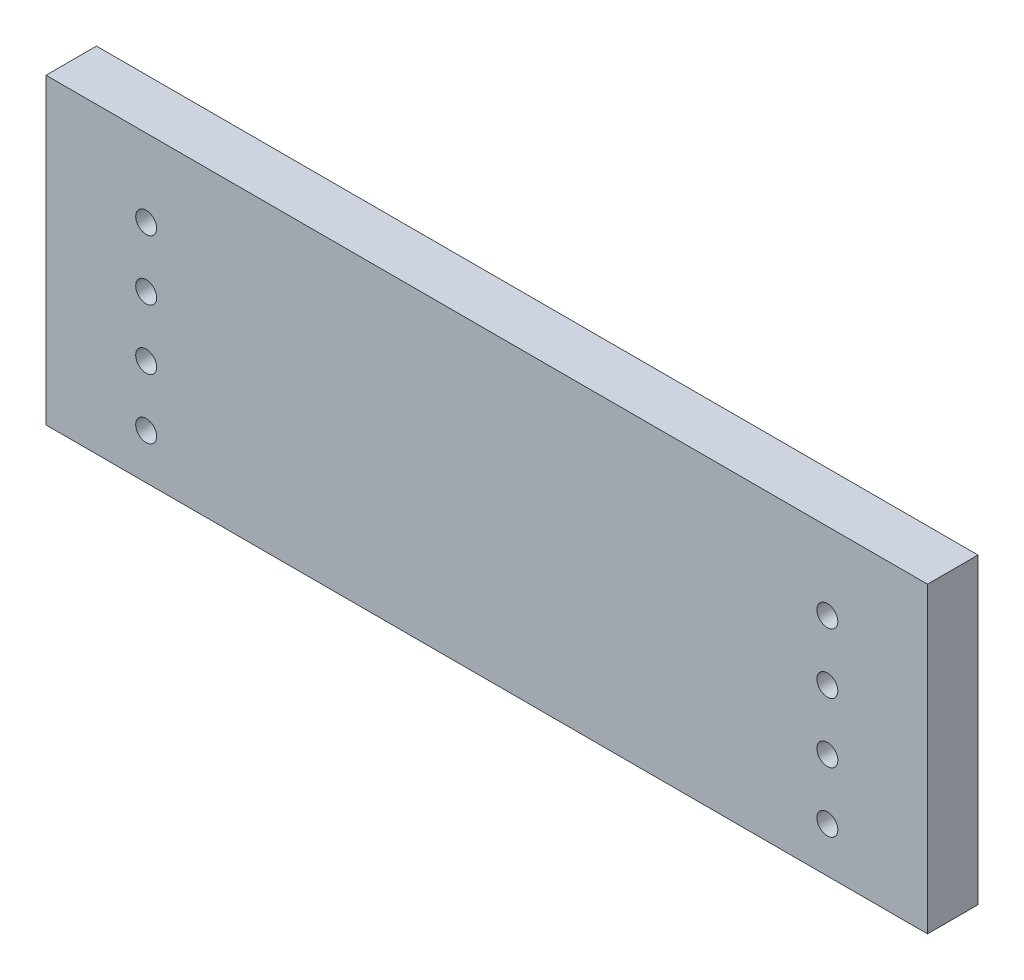
ISO-10303-21;
HEADER;
FILE_DESCRIPTION(('STEP AP214'),'2;1');
FILE_NAME('part.step','',(''),(''),'','','');
FILE_SCHEMA(('AUTOMOTIVE_DESIGN { 1 0 10303 214 1 1 1 1 }'));
ENDSEC;
DATA;
#1=APPLICATION_CONTEXT('core data for automotive mechanical design processes');
#2=APPLICATION_PROTOCOL_DEFINITION('international standard','automotive_design',2000,#1);
#3=PRODUCT_CONTEXT('',#1,'mechanical');
#4=PRODUCT('Part','Part','',(#3));
#5=PRODUCT_RELATED_PRODUCT_CATEGORY('part','',(#4));
#6=PRODUCT_DEFINITION_FORMATION('','',#4);
#7=PRODUCT_DEFINITION_CONTEXT('part definition',#1,'design');
#8=PRODUCT_DEFINITION('design','',#6,#7);
#9=PRODUCT_DEFINITION_SHAPE('','',#8);
#10=(LENGTH_UNIT() NAMED_UNIT(*) SI_UNIT(.MILLI.,.METRE.));
#11=(NAMED_UNIT(*) PLANE_ANGLE_UNIT() SI_UNIT($,.RADIAN.));
#12=(NAMED_UNIT(*) SI_UNIT($,.STERADIAN.) SOLID_ANGLE_UNIT());
#13=UNCERTAINTY_MEASURE_WITH_UNIT(LENGTH_MEASURE(1.E-05),#10,'distance_accuracy_value','');
#14=(GEOMETRIC_REPRESENTATION_CONTEXT(3) GLOBAL_UNCERTAINTY_ASSIGNED_CONTEXT((#13)) GLOBAL_UNIT_ASSIGNED_CONTEXT((#10,
#11,#12)) REPRESENTATION_CONTEXT('',''));
#15=CARTESIAN_POINT('',(0.,0.,0.));
#16=DIRECTION('',(0.,0.,1.));
#17=DIRECTION('',(1.,0.,0.));
#18=AXIS2_PLACEMENT_3D('',#15,#16,#17);
#19=CARTESIAN_POINT('',(104.775,-36.,-6.));
#20=DIRECTION('',(0.,0.,1.));
#21=DIRECTION('',(1.,0.,0.));
#22=AXIS2_PLACEMENT_3D('',#19,#20,#21);
#23=PLANE('',#22);
#24=CARTESIAN_POINT('',(-64.15,10.,-6.));
#25=DIRECTION('',(0.,0.,-1.));
#26=DIRECTION('',(-1.,0.,0.));
#27=AXIS2_PLACEMENT_3D('',#24,#25,#26);
#28=CIRCLE('',#27,5.25);
#29=CARTESIAN_POINT('',(-69.4,10.,-6.));
#30=VERTEX_POINT('',#29);
#31=EDGE_CURVE('E269',#30,#30,#28,.T.);
#32=ORIENTED_EDGE('',*,*,#31,.F.);
#33=EDGE_LOOP('',(#32));
#34=FACE_BOUND('',#33,.T.);
#35=CARTESIAN_POINT('',(-50.15,10.,-6.));
#36=DIRECTION('',(0.,0.,-1.));
#37=DIRECTION('',(-1.,0.,0.));
#38=AXIS2_PLACEMENT_3D('',#35,#36,#37);
#39=CIRCLE('',#38,5.25);
#40=CARTESIAN_POINT('',(-55.4,10.,-6.));
#41=VERTEX_POINT('',#40);
#42=EDGE_CURVE('E265',#41,#41,#39,.T.);
#43=ORIENTED_EDGE('',*,*,#42,.F.);
#44=EDGE_LOOP('',(#43));
#45=FACE_BOUND('',#44,.T.);
#46=CARTESIAN_POINT('',(-80.9625,-25.2375,-6.));
#47=DIRECTION('',(0.,0.,-1.));
#48=DIRECTION('',(-1.,0.,0.));
#49=AXIS2_PLACEMENT_3D('',#46,#47,#48);
#50=CIRCLE('',#49,4.96062);
#51=CARTESIAN_POINT('',(-85.92312,-25.2375,-6.));
#52=VERTEX_POINT('',#51);
#53=EDGE_CURVE('E256',#52,#52,#50,.T.);
#54=ORIENTED_EDGE('',*,*,#53,.F.);
#55=EDGE_LOOP('',(#54));
#56=FACE_BOUND('',#55,.T.);
#57=CARTESIAN_POINT('',(-80.9625,-10.95,-6.));
#58=DIRECTION('',(0.,0.,-1.));
#59=DIRECTION('',(-1.,0.,0.));
#60=AXIS2_PLACEMENT_3D('',#57,#58,#59);
#61=CIRCLE('',#60,4.96062);
#62=CARTESIAN_POINT('',(-85.9231200000001,-10.95,-6.));
#63=VERTEX_POINT('',#62);
#64=EDGE_CURVE('E240',#63,#63,#61,.T.);
#65=ORIENTED_EDGE('',*,*,#64,.F.);
#66=EDGE_LOOP('',(#65));
#67=FACE_BOUND('',#66,.T.);
#68=CARTESIAN_POINT('',(-80.9625000000001,3.33750000000001,-6.));
#69=DIRECTION('',(0.,0.,-1.));
#70=DIRECTION('',(-1.,0.,0.));
#71=AXIS2_PLACEMENT_3D('',#68,#69,#70);
#72=CIRCLE('',#71,4.96062);
#73=CARTESIAN_POINT('',(-85.9231200000001,3.33750000000001,-6.));
#74=VERTEX_POINT('',#73);
#75=EDGE_CURVE('E224',#74,#74,#72,.T.);
#76=ORIENTED_EDGE('',*,*,#75,.F.);
#77=EDGE_LOOP('',(#76));
#78=FACE_BOUND('',#77,.T.);
#79=CARTESIAN_POINT('',(-80.9625000000001,17.625,-6.));
#80=DIRECTION('',(0.,0.,-1.));
#81=DIRECTION('',(-1.,0.,0.));
#82=AXIS2_PLACEMENT_3D('',#79,#80,#81);
#83=CIRCLE('',#82,4.96062);
#84=CARTESIAN_POINT('',(-85.9231200000001,17.625,-6.));
#85=VERTEX_POINT('',#84);
#86=EDGE_CURVE('E208',#85,#85,#83,.T.);
#87=ORIENTED_EDGE('',*,*,#86,.F.);
#88=EDGE_LOOP('',(#87));
#89=FACE_BOUND('',#88,.T.);
#90=CARTESIAN_POINT('',(80.9625,-25.2375,-6.));
#91=DIRECTION('',(0.,0.,-1.));
#92=DIRECTION('',(-1.,0.,0.));
#93=AXIS2_PLACEMENT_3D('',#90,#91,#92);
#94=CIRCLE('',#93,4.96062);
#95=CARTESIAN_POINT('',(76.00188,-25.2375,-6.));
#96=VERTEX_POINT('',#95);
#97=EDGE_CURVE('E192',#96,#96,#94,.T.);
#98=ORIENTED_EDGE('',*,*,#97,.F.);
#99=EDGE_LOOP('',(#98));
#100=FACE_BOUND('',#99,.T.);
#101=CARTESIAN_POINT('',(80.9625,-10.95,-6.));
#102=DIRECTION('',(0.,0.,-1.));
#103=DIRECTION('',(-1.,0.,0.));
#104=AXIS2_PLACEMENT_3D('',#101,#102,#103);
#105=CIRCLE('',#104,4.96062);
#106=CARTESIAN_POINT('',(76.00188,-10.95,-6.));
#107=VERTEX_POINT('',#106);
#108=EDGE_CURVE('E176',#107,#107,#105,.T.);
#109=ORIENTED_EDGE('',*,*,#108,.F.);
#110=EDGE_LOOP('',(#109));
#111=FACE_BOUND('',#110,.T.);
#112=CARTESIAN_POINT('',(80.9625000000001,3.33750000000001,-6.));
#113=DIRECTION('',(0.,0.,-1.));
#114=DIRECTION('',(-1.,0.,0.));
#115=AXIS2_PLACEMENT_3D('',#112,#113,#114);
#116=CIRCLE('',#115,4.96062);
#117=CARTESIAN_POINT('',(76.0018800000001,3.33750000000001,-6.));
#118=VERTEX_POINT('',#117);
#119=EDGE_CURVE('E160',#118,#118,#116,.T.);
#120=ORIENTED_EDGE('',*,*,#119,.F.);
#121=EDGE_LOOP('',(#120));
#122=FACE_BOUND('',#121,.T.);
#123=CARTESIAN_POINT('',(80.9625000000001,17.625,-6.));
#124=DIRECTION('',(0.,0.,-1.));
#125=DIRECTION('',(-1.,0.,0.));
#126=AXIS2_PLACEMENT_3D('',#123,#124,#125);
#127=CIRCLE('',#126,4.96062);
#128=CARTESIAN_POINT('',(76.0018800000001,17.625,-6.));
#129=VERTEX_POINT('',#128);
#130=EDGE_CURVE('E144',#129,#129,#127,.T.);
#131=ORIENTED_EDGE('',*,*,#130,.F.);
#132=EDGE_LOOP('',(#131));
#133=FACE_BOUND('',#132,.T.);
#134=DIRECTION('',(0.,1.,0.));
#135=VECTOR('',#134,1.);
#136=CARTESIAN_POINT('',(-104.775,-36.,-6.));
#137=LINE('',#136,#135);
#138=CARTESIAN_POINT('',(-104.775,-36.,-6.));
#139=VERTEX_POINT('',#138);
#140=CARTESIAN_POINT('',(-104.775,36.,-6.));
#141=VERTEX_POINT('',#140);
#142=EDGE_CURVE('E112',#139,#141,#137,.T.);
#143=ORIENTED_EDGE('',*,*,#142,.T.);
#144=DIRECTION('',(-1.,0.,0.));
#145=VECTOR('',#144,1.);
#146=CARTESIAN_POINT('',(104.775,36.,-6.));
#147=LINE('',#146,#145);
#148=CARTESIAN_POINT('',(104.775,36.,-6.));
#149=VERTEX_POINT('',#148);
#150=EDGE_CURVE('E11',#149,#141,#147,.T.);
#151=ORIENTED_EDGE('',*,*,#150,.F.);
#152=DIRECTION('',(0.,1.,0.));
#153=VECTOR('',#152,1.);
#154=CARTESIAN_POINT('',(104.775,-36.,-6.));
#155=LINE('',#154,#153);
#156=CARTESIAN_POINT('',(104.775,-36.,-6.));
#157=VERTEX_POINT('',#156);
#158=EDGE_CURVE('E96',#157,#149,#155,.T.);
#159=ORIENTED_EDGE('',*,*,#158,.F.);
#160=DIRECTION('',(-1.,0.,0.));
#161=VECTOR('',#160,1.);
#162=CARTESIAN_POINT('',(104.775,-36.,-6.));
#163=LINE('',#162,#161);
#164=EDGE_CURVE('E108',#157,#139,#163,.T.);
#165=ORIENTED_EDGE('',*,*,#164,.T.);
#166=EDGE_LOOP('',(#143,#151,#159,#165));
#167=FACE_BOUND('',#166,.T.);
#168=ADVANCED_FACE('F44',(#34,#45,#56,#67,#78,#89,#100,#111,#122,#133,#167),#23,.F.);
#169=CARTESIAN_POINT('',(104.775,36.,6.));
#170=DIRECTION('',(0.,-1.,0.));
#171=DIRECTION('',(0.,0.,-1.));
#172=AXIS2_PLACEMENT_3D('',#169,#170,#171);
#173=PLANE('',#172);
#174=DIRECTION('',(0.,0.,1.));
#175=VECTOR('',#174,1.);
#176=CARTESIAN_POINT('',(-104.775,36.,6.));
#177=LINE('',#176,#175);
#178=CARTESIAN_POINT('',(-104.775,36.,6.));
#179=VERTEX_POINT('',#178);
#180=EDGE_CURVE('E101',#141,#179,#177,.T.);
#181=ORIENTED_EDGE('',*,*,#180,.T.);
#182=DIRECTION('',(-1.,0.,0.));
#183=VECTOR('',#182,1.);
#184=CARTESIAN_POINT('',(104.775,36.,6.));
#185=LINE('',#184,#183);
#186=CARTESIAN_POINT('',(104.775,36.,6.));
#187=VERTEX_POINT('',#186);
#188=EDGE_CURVE('E53',#187,#179,#185,.T.);
#189=ORIENTED_EDGE('',*,*,#188,.F.);
#190=DIRECTION('',(0.,0.,1.));
#191=VECTOR('',#190,1.);
#192=CARTESIAN_POINT('',(104.775,36.,6.));
#193=LINE('',#192,#191);
#194=EDGE_CURVE('E91',#149,#187,#193,.T.);
#195=ORIENTED_EDGE('',*,*,#194,.F.);
#196=ORIENTED_EDGE('',*,*,#150,.T.);
#197=EDGE_LOOP('',(#181,#189,#195,#196));
#198=FACE_BOUND('',#197,.T.);
#199=ADVANCED_FACE('F100',(#198),#173,.F.);
#200=CARTESIAN_POINT('',(104.775,-36.,6.));
#201=DIRECTION('',(0.,0.,-1.));
#202=DIRECTION('',(-1.,0.,0.));
#203=AXIS2_PLACEMENT_3D('',#200,#201,#202);
#204=PLANE('',#203);
#205=CARTESIAN_POINT('',(-80.9625,-25.2375,6.));
#206=DIRECTION('',(0.,0.,-1.));
#207=DIRECTION('',(-1.,0.,0.));
#208=AXIS2_PLACEMENT_3D('',#205,#206,#207);
#209=CIRCLE('',#208,2.48920000000001);
#210=CARTESIAN_POINT('',(-83.4517,-25.2375,6.));
#211=VERTEX_POINT('',#210);
#212=EDGE_CURVE('E244',#211,#211,#209,.T.);
#213=ORIENTED_EDGE('',*,*,#212,.T.);
#214=EDGE_LOOP('',(#213));
#215=FACE_BOUND('',#214,.T.);
#216=CARTESIAN_POINT('',(-80.9625,-10.95,6.));
#217=DIRECTION('',(0.,0.,-1.));
#218=DIRECTION('',(-1.,0.,0.));
#219=AXIS2_PLACEMENT_3D('',#216,#217,#218);
#220=CIRCLE('',#219,2.48920000000001);
#221=CARTESIAN_POINT('',(-83.4517000000001,-10.95,6.));
#222=VERTEX_POINT('',#221);
#223=EDGE_CURVE('E228',#222,#222,#220,.T.);
#224=ORIENTED_EDGE('',*,*,#223,.T.);
#225=EDGE_LOOP('',(#224));
#226=FACE_BOUND('',#225,.T.);
#227=CARTESIAN_POINT('',(-80.9625000000001,3.33750000000001,6.));
#228=DIRECTION('',(0.,0.,-1.));
#229=DIRECTION('',(-1.,0.,0.));
#230=AXIS2_PLACEMENT_3D('',#227,#228,#229);
#231=CIRCLE('',#230,2.48920000000001);
#232=CARTESIAN_POINT('',(-83.4517000000001,3.33750000000001,6.));
#233=VERTEX_POINT('',#232);
#234=EDGE_CURVE('E212',#233,#233,#231,.T.);
#235=ORIENTED_EDGE('',*,*,#234,.T.);
#236=EDGE_LOOP('',(#235));
#237=FACE_BOUND('',#236,.T.);
#238=CARTESIAN_POINT('',(-80.9625000000001,17.625,6.));
#239=DIRECTION('',(0.,0.,-1.));
#240=DIRECTION('',(-1.,0.,0.));
#241=AXIS2_PLACEMENT_3D('',#238,#239,#240);
#242=CIRCLE('',#241,2.48920000000001);
#243=CARTESIAN_POINT('',(-83.4517000000002,17.625,6.));
#244=VERTEX_POINT('',#243);
#245=EDGE_CURVE('E196',#244,#244,#242,.T.);
#246=ORIENTED_EDGE('',*,*,#245,.T.);
#247=EDGE_LOOP('',(#246));
#248=FACE_BOUND('',#247,.T.);
#249=CARTESIAN_POINT('',(80.9625,-25.2375,6.));
#250=DIRECTION('',(0.,0.,-1.));
#251=DIRECTION('',(-1.,0.,0.));
#252=AXIS2_PLACEMENT_3D('',#249,#250,#251);
#253=CIRCLE('',#252,2.48920000000001);
#254=CARTESIAN_POINT('',(78.4733,-25.2375,6.));
#255=VERTEX_POINT('',#254);
#256=EDGE_CURVE('E180',#255,#255,#253,.T.);
#257=ORIENTED_EDGE('',*,*,#256,.T.);
#258=EDGE_LOOP('',(#257));
#259=FACE_BOUND('',#258,.T.);
#260=CARTESIAN_POINT('',(80.9625,-10.95,6.));
#261=DIRECTION('',(0.,0.,-1.));
#262=DIRECTION('',(-1.,0.,0.));
#263=AXIS2_PLACEMENT_3D('',#260,#261,#262);
#264=CIRCLE('',#263,2.48920000000001);
#265=CARTESIAN_POINT('',(78.4733,-10.95,6.));
#266=VERTEX_POINT('',#265);
#267=EDGE_CURVE('E164',#266,#266,#264,.T.);
#268=ORIENTED_EDGE('',*,*,#267,.T.);
#269=EDGE_LOOP('',(#268));
#270=FACE_BOUND('',#269,.T.);
#271=CARTESIAN_POINT('',(80.9625000000001,3.33750000000001,6.));
#272=DIRECTION('',(0.,0.,-1.));
#273=DIRECTION('',(-1.,0.,0.));
#274=AXIS2_PLACEMENT_3D('',#271,#272,#273);
#275=CIRCLE('',#274,2.48920000000001);
#276=CARTESIAN_POINT('',(78.4733000000001,3.33750000000001,6.));
#277=VERTEX_POINT('',#276);
#278=EDGE_CURVE('E148',#277,#277,#275,.T.);
#279=ORIENTED_EDGE('',*,*,#278,.T.);
#280=EDGE_LOOP('',(#279));
#281=FACE_BOUND('',#280,.T.);
#282=CARTESIAN_POINT('',(80.9625000000001,17.625,6.));
#283=DIRECTION('',(0.,0.,-1.));
#284=DIRECTION('',(-1.,0.,0.));
#285=AXIS2_PLACEMENT_3D('',#282,#283,#284);
#286=CIRCLE('',#285,2.48920000000001);
#287=CARTESIAN_POINT('',(78.4733000000001,17.625,6.));
#288=VERTEX_POINT('',#287);
#289=EDGE_CURVE('E116',#288,#288,#286,.T.);
#290=ORIENTED_EDGE('',*,*,#289,.T.);
#291=EDGE_LOOP('',(#290));
#292=FACE_BOUND('',#291,.T.);
#293=DIRECTION('',(0.,-1.,0.));
#294=VECTOR('',#293,1.);
#295=CARTESIAN_POINT('',(-104.775,-36.,6.));
#296=LINE('',#295,#294);
#297=CARTESIAN_POINT('',(-104.775,-36.,6.));
#298=VERTEX_POINT('',#297);
#299=EDGE_CURVE('E78',#179,#298,#296,.T.);
#300=ORIENTED_EDGE('',*,*,#299,.T.);
#301=DIRECTION('',(-1.,0.,0.));
#302=VECTOR('',#301,1.);
#303=CARTESIAN_POINT('',(104.775,-36.,6.));
#304=LINE('',#303,#302);
#305=CARTESIAN_POINT('',(104.775,-36.,6.));
#306=VERTEX_POINT('',#305);
#307=EDGE_CURVE('E103',#306,#298,#304,.T.);
#308=ORIENTED_EDGE('',*,*,#307,.F.);
#309=DIRECTION('',(0.,-1.,0.));
#310=VECTOR('',#309,1.);
#311=CARTESIAN_POINT('',(104.775,-36.,6.));
#312=LINE('',#311,#310);
#313=EDGE_CURVE('E94',#187,#306,#312,.T.);
#314=ORIENTED_EDGE('',*,*,#313,.F.);
#315=ORIENTED_EDGE('',*,*,#188,.T.);
#316=EDGE_LOOP('',(#300,#308,#314,#315));
#317=FACE_BOUND('',#316,.T.);
#318=ADVANCED_FACE('F104',(#215,#226,#237,#248,#259,#270,#281,#292,#317),#204,.F.);
#319=CARTESIAN_POINT('',(104.775,-36.,6.));
#320=DIRECTION('',(0.,1.,0.));
#321=DIRECTION('',(0.,0.,1.));
#322=AXIS2_PLACEMENT_3D('',#319,#320,#321);
#323=PLANE('',#322);
#324=DIRECTION('',(0.,0.,-1.));
#325=VECTOR('',#324,1.);
#326=CARTESIAN_POINT('',(-104.775,-36.,6.));
#327=LINE('',#326,#325);
#328=EDGE_CURVE('E84',#298,#139,#327,.T.);
#329=ORIENTED_EDGE('',*,*,#328,.T.);
#330=ORIENTED_EDGE('',*,*,#164,.F.);
#331=DIRECTION('',(0.,0.,-1.));
#332=VECTOR('',#331,1.);
#333=CARTESIAN_POINT('',(104.775,-36.,6.));
#334=LINE('',#333,#332);
#335=EDGE_CURVE('E61',#306,#157,#334,.T.);
#336=ORIENTED_EDGE('',*,*,#335,.F.);
#337=ORIENTED_EDGE('',*,*,#307,.T.);
#338=EDGE_LOOP('',(#329,#330,#336,#337));
#339=FACE_BOUND('',#338,.T.);
#340=ADVANCED_FACE('F126',(#339),#323,.F.);
#341=CARTESIAN_POINT('',(104.775,0.,0.));
#342=DIRECTION('',(-1.,0.,0.));
#343=DIRECTION('',(0.,0.,1.));
#344=AXIS2_PLACEMENT_3D('',#341,#342,#343);
#345=PLANE('',#344);
#346=ORIENTED_EDGE('',*,*,#158,.T.);
#347=ORIENTED_EDGE('',*,*,#194,.T.);
#348=ORIENTED_EDGE('',*,*,#313,.T.);
#349=ORIENTED_EDGE('',*,*,#335,.T.);
#350=EDGE_LOOP('',(#346,#347,#348,#349));
#351=FACE_BOUND('',#350,.T.);
#352=ADVANCED_FACE('F92',(#351),#345,.F.);
#353=CARTESIAN_POINT('',(-104.775,0.,0.));
#354=DIRECTION('',(-1.,0.,0.));
#355=DIRECTION('',(0.,0.,1.));
#356=AXIS2_PLACEMENT_3D('',#353,#354,#355);
#357=PLANE('',#356);
#358=ORIENTED_EDGE('',*,*,#142,.F.);
#359=ORIENTED_EDGE('',*,*,#328,.F.);
#360=ORIENTED_EDGE('',*,*,#299,.F.);
#361=ORIENTED_EDGE('',*,*,#180,.F.);
#362=EDGE_LOOP('',(#358,#359,#360,#361));
#363=FACE_BOUND('',#362,.T.);
#364=ADVANCED_FACE('F129',(#363),#357,.T.);
#365=CARTESIAN_POINT('',(80.9625000000001,17.625,-6.));
#366=DIRECTION('',(0.,0.,-1.));
#367=DIRECTION('',(-1.,0.,0.));
#368=AXIS2_PLACEMENT_3D('',#365,#366,#367);
#369=CYLINDRICAL_SURFACE('',#368,2.4892);
#370=ORIENTED_EDGE('',*,*,#289,.F.);
#371=EDGE_LOOP('',(#370));
#372=FACE_BOUND('',#371,.T.);
#373=CARTESIAN_POINT('',(80.9625000000001,17.625,-3.4346));
#374=DIRECTION('',(0.,0.,-1.));
#375=DIRECTION('',(-1.,0.,0.));
#376=AXIS2_PLACEMENT_3D('',#373,#374,#375);
#377=CIRCLE('',#376,2.4892);
#378=CARTESIAN_POINT('',(78.4733000000002,17.625,-3.4346));
#379=VERTEX_POINT('',#378);
#380=EDGE_CURVE('E136',#379,#379,#377,.T.);
#381=ORIENTED_EDGE('',*,*,#380,.T.);
#382=EDGE_LOOP('',(#381));
#383=FACE_BOUND('',#382,.T.);
#384=ADVANCED_FACE('F319',(#372,#383),#369,.F.);
#385=CARTESIAN_POINT('',(83.4517000000001,17.625,-3.4346));
#386=DIRECTION('',(0.,0.,1.));
#387=DIRECTION('',(1.,0.,0.));
#388=AXIS2_PLACEMENT_3D('',#385,#386,#387);
#389=PLANE('',#388);
#390=ORIENTED_EDGE('',*,*,#380,.F.);
#391=EDGE_LOOP('',(#390));
#392=FACE_BOUND('',#391,.T.);
#393=CARTESIAN_POINT('',(80.9625000000001,17.625,-3.4346));
#394=DIRECTION('',(0.,0.,-1.));
#395=DIRECTION('',(-1.,0.,0.));
#396=AXIS2_PLACEMENT_3D('',#393,#394,#395);
#397=CIRCLE('',#396,4.96062);
#398=CARTESIAN_POINT('',(76.0018800000001,17.625,-3.4346));
#399=VERTEX_POINT('',#398);
#400=EDGE_CURVE('E140',#399,#399,#397,.T.);
#401=ORIENTED_EDGE('',*,*,#400,.T.);
#402=EDGE_LOOP('',(#401));
#403=FACE_BOUND('',#402,.T.);
#404=ADVANCED_FACE('F309',(#392,#403),#389,.F.);
#405=CARTESIAN_POINT('',(80.9625000000001,17.625,-6.));
#406=DIRECTION('',(0.,0.,-1.));
#407=DIRECTION('',(-1.,0.,0.));
#408=AXIS2_PLACEMENT_3D('',#405,#406,#407);
#409=CYLINDRICAL_SURFACE('',#408,4.96062);
#410=ORIENTED_EDGE('',*,*,#400,.F.);
#411=EDGE_LOOP('',(#410));
#412=FACE_BOUND('',#411,.T.);
#413=ORIENTED_EDGE('',*,*,#130,.T.);
#414=EDGE_LOOP('',(#413));
#415=FACE_BOUND('',#414,.T.);
#416=ADVANCED_FACE('F306',(#412,#415),#409,.F.);
#417=CARTESIAN_POINT('',(80.9625000000001,3.33750000000001,-6.));
#418=DIRECTION('',(0.,0.,-1.));
#419=DIRECTION('',(-1.,0.,0.));
#420=AXIS2_PLACEMENT_3D('',#417,#418,#419);
#421=CYLINDRICAL_SURFACE('',#420,2.4892);
#422=ORIENTED_EDGE('',*,*,#278,.F.);
#423=EDGE_LOOP('',(#422));
#424=FACE_BOUND('',#423,.T.);
#425=CARTESIAN_POINT('',(80.9625000000001,3.33750000000001,-3.4346));
#426=DIRECTION('',(0.,0.,-1.));
#427=DIRECTION('',(-1.,0.,0.));
#428=AXIS2_PLACEMENT_3D('',#425,#426,#427);
#429=CIRCLE('',#428,2.4892);
#430=CARTESIAN_POINT('',(78.4733000000001,3.33750000000001,-3.4346));
#431=VERTEX_POINT('',#430);
#432=EDGE_CURVE('E152',#431,#431,#429,.T.);
#433=ORIENTED_EDGE('',*,*,#432,.T.);
#434=EDGE_LOOP('',(#433));
#435=FACE_BOUND('',#434,.T.);
#436=ADVANCED_FACE('F308',(#424,#435),#421,.F.);
#437=CARTESIAN_POINT('',(83.4517000000001,3.33750000000001,-3.4346));
#438=DIRECTION('',(0.,0.,1.));
#439=DIRECTION('',(1.,0.,0.));
#440=AXIS2_PLACEMENT_3D('',#437,#438,#439);
#441=PLANE('',#440);
#442=ORIENTED_EDGE('',*,*,#432,.F.);
#443=EDGE_LOOP('',(#442));
#444=FACE_BOUND('',#443,.T.);
#445=CARTESIAN_POINT('',(80.9625000000001,3.33750000000001,-3.4346));
#446=DIRECTION('',(0.,0.,-1.));
#447=DIRECTION('',(-1.,0.,0.));
#448=AXIS2_PLACEMENT_3D('',#445,#446,#447);
#449=CIRCLE('',#448,4.96062);
#450=CARTESIAN_POINT('',(76.0018800000001,3.33750000000001,-3.4346));
#451=VERTEX_POINT('',#450);
#452=EDGE_CURVE('E156',#451,#451,#449,.T.);
#453=ORIENTED_EDGE('',*,*,#452,.T.);
#454=EDGE_LOOP('',(#453));
#455=FACE_BOUND('',#454,.T.);
#456=ADVANCED_FACE('F316',(#444,#455),#441,.F.);
#457=CARTESIAN_POINT('',(80.9625000000001,3.33750000000001,-6.));
#458=DIRECTION('',(0.,0.,-1.));
#459=DIRECTION('',(-1.,0.,0.));
#460=AXIS2_PLACEMENT_3D('',#457,#458,#459);
#461=CYLINDRICAL_SURFACE('',#460,4.96062);
#462=ORIENTED_EDGE('',*,*,#452,.F.);
#463=EDGE_LOOP('',(#462));
#464=FACE_BOUND('',#463,.T.);
#465=ORIENTED_EDGE('',*,*,#119,.T.);
#466=EDGE_LOOP('',(#465));
#467=FACE_BOUND('',#466,.T.);
#468=ADVANCED_FACE('F388',(#464,#467),#461,.F.);
#469=CARTESIAN_POINT('',(80.9625,-10.95,-6.));
#470=DIRECTION('',(0.,0.,-1.));
#471=DIRECTION('',(-1.,0.,0.));
#472=AXIS2_PLACEMENT_3D('',#469,#470,#471);
#473=CYLINDRICAL_SURFACE('',#472,2.4892);
#474=ORIENTED_EDGE('',*,*,#267,.F.);
#475=EDGE_LOOP('',(#474));
#476=FACE_BOUND('',#475,.T.);
#477=CARTESIAN_POINT('',(80.9625,-10.95,-3.4346));
#478=DIRECTION('',(0.,0.,-1.));
#479=DIRECTION('',(-1.,0.,0.));
#480=AXIS2_PLACEMENT_3D('',#477,#478,#479);
#481=CIRCLE('',#480,2.4892);
#482=CARTESIAN_POINT('',(78.4733000000001,-10.95,-3.4346));
#483=VERTEX_POINT('',#482);
#484=EDGE_CURVE('E168',#483,#483,#481,.T.);
#485=ORIENTED_EDGE('',*,*,#484,.T.);
#486=EDGE_LOOP('',(#485));
#487=FACE_BOUND('',#486,.T.);
#488=ADVANCED_FACE('F398',(#476,#487),#473,.F.);
#489=CARTESIAN_POINT('',(83.4517,-10.95,-3.4346));
#490=DIRECTION('',(0.,0.,1.));
#491=DIRECTION('',(1.,0.,0.));
#492=AXIS2_PLACEMENT_3D('',#489,#490,#491);
#493=PLANE('',#492);
#494=ORIENTED_EDGE('',*,*,#484,.F.);
#495=EDGE_LOOP('',(#494));
#496=FACE_BOUND('',#495,.T.);
#497=CARTESIAN_POINT('',(80.9625,-10.95,-3.4346));
#498=DIRECTION('',(0.,0.,-1.));
#499=DIRECTION('',(-1.,0.,0.));
#500=AXIS2_PLACEMENT_3D('',#497,#498,#499);
#501=CIRCLE('',#500,4.96062);
#502=CARTESIAN_POINT('',(76.00188,-10.95,-3.4346));
#503=VERTEX_POINT('',#502);
#504=EDGE_CURVE('E172',#503,#503,#501,.T.);
#505=ORIENTED_EDGE('',*,*,#504,.T.);
#506=EDGE_LOOP('',(#505));
#507=FACE_BOUND('',#506,.T.);
#508=ADVANCED_FACE('F409',(#496,#507),#493,.F.);
#509=CARTESIAN_POINT('',(80.9625,-10.95,-6.));
#510=DIRECTION('',(0.,0.,-1.));
#511=DIRECTION('',(-1.,0.,0.));
#512=AXIS2_PLACEMENT_3D('',#509,#510,#511);
#513=CYLINDRICAL_SURFACE('',#512,4.96062);
#514=ORIENTED_EDGE('',*,*,#504,.F.);
#515=EDGE_LOOP('',(#514));
#516=FACE_BOUND('',#515,.T.);
#517=ORIENTED_EDGE('',*,*,#108,.T.);
#518=EDGE_LOOP('',(#517));
#519=FACE_BOUND('',#518,.T.);
#520=ADVANCED_FACE('F420',(#516,#519),#513,.F.);
#521=CARTESIAN_POINT('',(80.9625,-25.2375,-6.));
#522=DIRECTION('',(0.,0.,-1.));
#523=DIRECTION('',(-1.,0.,0.));
#524=AXIS2_PLACEMENT_3D('',#521,#522,#523);
#525=CYLINDRICAL_SURFACE('',#524,2.4892);
#526=ORIENTED_EDGE('',*,*,#256,.F.);
#527=EDGE_LOOP('',(#526));
#528=FACE_BOUND('',#527,.T.);
#529=CARTESIAN_POINT('',(80.9625,-25.2375,-3.4346));
#530=DIRECTION('',(0.,0.,-1.));
#531=DIRECTION('',(-1.,0.,0.));
#532=AXIS2_PLACEMENT_3D('',#529,#530,#531);
#533=CIRCLE('',#532,2.4892);
#534=CARTESIAN_POINT('',(78.4733,-25.2375,-3.4346));
#535=VERTEX_POINT('',#534);
#536=EDGE_CURVE('E184',#535,#535,#533,.T.);
#537=ORIENTED_EDGE('',*,*,#536,.T.);
#538=EDGE_LOOP('',(#537));
#539=FACE_BOUND('',#538,.T.);
#540=ADVANCED_FACE('F431',(#528,#539),#525,.F.);
#541=CARTESIAN_POINT('',(83.4517,-25.2375,-3.4346));
#542=DIRECTION('',(0.,0.,1.));
#543=DIRECTION('',(1.,0.,0.));
#544=AXIS2_PLACEMENT_3D('',#541,#542,#543);
#545=PLANE('',#544);
#546=ORIENTED_EDGE('',*,*,#536,.F.);
#547=EDGE_LOOP('',(#546));
#548=FACE_BOUND('',#547,.T.);
#549=CARTESIAN_POINT('',(80.9625,-25.2375,-3.4346));
#550=DIRECTION('',(0.,0.,-1.));
#551=DIRECTION('',(-1.,0.,0.));
#552=AXIS2_PLACEMENT_3D('',#549,#550,#551);
#553=CIRCLE('',#552,4.96062);
#554=CARTESIAN_POINT('',(76.00188,-25.2375,-3.4346));
#555=VERTEX_POINT('',#554);
#556=EDGE_CURVE('E188',#555,#555,#553,.T.);
#557=ORIENTED_EDGE('',*,*,#556,.T.);
#558=EDGE_LOOP('',(#557));
#559=FACE_BOUND('',#558,.T.);
#560=ADVANCED_FACE('F442',(#548,#559),#545,.F.);
#561=CARTESIAN_POINT('',(80.9625,-25.2375,-6.));
#562=DIRECTION('',(0.,0.,-1.));
#563=DIRECTION('',(-1.,0.,0.));
#564=AXIS2_PLACEMENT_3D('',#561,#562,#563);
#565=CYLINDRICAL_SURFACE('',#564,4.96062);
#566=ORIENTED_EDGE('',*,*,#556,.F.);
#567=EDGE_LOOP('',(#566));
#568=FACE_BOUND('',#567,.T.);
#569=ORIENTED_EDGE('',*,*,#97,.T.);
#570=EDGE_LOOP('',(#569));
#571=FACE_BOUND('',#570,.T.);
#572=ADVANCED_FACE('F453',(#568,#571),#565,.F.);
#573=CARTESIAN_POINT('',(-80.9625000000001,17.625,-6.));
#574=DIRECTION('',(0.,0.,-1.));
#575=DIRECTION('',(-1.,0.,0.));
#576=AXIS2_PLACEMENT_3D('',#573,#574,#575);
#577=CYLINDRICAL_SURFACE('',#576,2.4892);
#578=ORIENTED_EDGE('',*,*,#245,.F.);
#579=EDGE_LOOP('',(#578));
#580=FACE_BOUND('',#579,.T.);
#581=CARTESIAN_POINT('',(-80.9625000000001,17.625,-3.4346));
#582=DIRECTION('',(0.,0.,-1.));
#583=DIRECTION('',(-1.,0.,0.));
#584=AXIS2_PLACEMENT_3D('',#581,#582,#583);
#585=CIRCLE('',#584,2.4892);
#586=CARTESIAN_POINT('',(-83.4517000000001,17.625,-3.4346));
#587=VERTEX_POINT('',#586);
#588=EDGE_CURVE('E200',#587,#587,#585,.T.);
#589=ORIENTED_EDGE('',*,*,#588,.T.);
#590=EDGE_LOOP('',(#589));
#591=FACE_BOUND('',#590,.T.);
#592=ADVANCED_FACE('F464',(#580,#591),#577,.F.);
#593=CARTESIAN_POINT('',(-78.4733000000002,17.625,-3.4346));
#594=DIRECTION('',(0.,0.,1.));
#595=DIRECTION('',(1.,0.,0.));
#596=AXIS2_PLACEMENT_3D('',#593,#594,#595);
#597=PLANE('',#596);
#598=ORIENTED_EDGE('',*,*,#588,.F.);
#599=EDGE_LOOP('',(#598));
#600=FACE_BOUND('',#599,.T.);
#601=CARTESIAN_POINT('',(-80.9625000000001,17.625,-3.4346));
#602=DIRECTION('',(0.,0.,-1.));
#603=DIRECTION('',(-1.,0.,0.));
#604=AXIS2_PLACEMENT_3D('',#601,#602,#603);
#605=CIRCLE('',#604,4.96062);
#606=CARTESIAN_POINT('',(-85.9231200000001,17.625,-3.4346));
#607=VERTEX_POINT('',#606);
#608=EDGE_CURVE('E204',#607,#607,#605,.T.);
#609=ORIENTED_EDGE('',*,*,#608,.T.);
#610=EDGE_LOOP('',(#609));
#611=FACE_BOUND('',#610,.T.);
#612=ADVANCED_FACE('F475',(#600,#611),#597,.F.);
#613=CARTESIAN_POINT('',(-80.9625000000001,17.625,-6.));
#614=DIRECTION('',(0.,0.,-1.));
#615=DIRECTION('',(-1.,0.,0.));
#616=AXIS2_PLACEMENT_3D('',#613,#614,#615);
#617=CYLINDRICAL_SURFACE('',#616,4.96062);
#618=ORIENTED_EDGE('',*,*,#608,.F.);
#619=EDGE_LOOP('',(#618));
#620=FACE_BOUND('',#619,.T.);
#621=ORIENTED_EDGE('',*,*,#86,.T.);
#622=EDGE_LOOP('',(#621));
#623=FACE_BOUND('',#622,.T.);
#624=ADVANCED_FACE('F486',(#620,#623),#617,.F.);
#625=CARTESIAN_POINT('',(-80.9625000000001,3.33750000000001,-6.));
#626=DIRECTION('',(0.,0.,-1.));
#627=DIRECTION('',(-1.,0.,0.));
#628=AXIS2_PLACEMENT_3D('',#625,#626,#627);
#629=CYLINDRICAL_SURFACE('',#628,2.4892);
#630=ORIENTED_EDGE('',*,*,#234,.F.);
#631=EDGE_LOOP('',(#630));
#632=FACE_BOUND('',#631,.T.);
#633=CARTESIAN_POINT('',(-80.9625000000001,3.33750000000001,-3.4346));
#634=DIRECTION('',(0.,0.,-1.));
#635=DIRECTION('',(-1.,0.,0.));
#636=AXIS2_PLACEMENT_3D('',#633,#634,#635);
#637=CIRCLE('',#636,2.4892);
#638=CARTESIAN_POINT('',(-83.4517000000001,3.33750000000001,-3.4346));
#639=VERTEX_POINT('',#638);
#640=EDGE_CURVE('E216',#639,#639,#637,.T.);
#641=ORIENTED_EDGE('',*,*,#640,.T.);
#642=EDGE_LOOP('',(#641));
#643=FACE_BOUND('',#642,.T.);
#644=ADVANCED_FACE('F497',(#632,#643),#629,.F.);
#645=CARTESIAN_POINT('',(-78.4733000000001,3.33750000000001,-3.4346));
#646=DIRECTION('',(0.,0.,1.));
#647=DIRECTION('',(1.,0.,0.));
#648=AXIS2_PLACEMENT_3D('',#645,#646,#647);
#649=PLANE('',#648);
#650=ORIENTED_EDGE('',*,*,#640,.F.);
#651=EDGE_LOOP('',(#650));
#652=FACE_BOUND('',#651,.T.);
#653=CARTESIAN_POINT('',(-80.9625000000001,3.33750000000001,-3.4346));
#654=DIRECTION('',(0.,0.,-1.));
#655=DIRECTION('',(-1.,0.,0.));
#656=AXIS2_PLACEMENT_3D('',#653,#654,#655);
#657=CIRCLE('',#656,4.96062);
#658=CARTESIAN_POINT('',(-85.9231200000001,3.33750000000001,-3.4346));
#659=VERTEX_POINT('',#658);
#660=EDGE_CURVE('E220',#659,#659,#657,.T.);
#661=ORIENTED_EDGE('',*,*,#660,.T.);
#662=EDGE_LOOP('',(#661));
#663=FACE_BOUND('',#662,.T.);
#664=ADVANCED_FACE('F508',(#652,#663),#649,.F.);
#665=CARTESIAN_POINT('',(-80.9625000000001,3.33750000000001,-6.));
#666=DIRECTION('',(0.,0.,-1.));
#667=DIRECTION('',(-1.,0.,0.));
#668=AXIS2_PLACEMENT_3D('',#665,#666,#667);
#669=CYLINDRICAL_SURFACE('',#668,4.96062);
#670=ORIENTED_EDGE('',*,*,#660,.F.);
#671=EDGE_LOOP('',(#670));
#672=FACE_BOUND('',#671,.T.);
#673=ORIENTED_EDGE('',*,*,#75,.T.);
#674=EDGE_LOOP('',(#673));
#675=FACE_BOUND('',#674,.T.);
#676=ADVANCED_FACE('F519',(#672,#675),#669,.F.);
#677=CARTESIAN_POINT('',(-80.9625,-10.95,-6.));
#678=DIRECTION('',(0.,0.,-1.));
#679=DIRECTION('',(-1.,0.,0.));
#680=AXIS2_PLACEMENT_3D('',#677,#678,#679);
#681=CYLINDRICAL_SURFACE('',#680,2.4892);
#682=ORIENTED_EDGE('',*,*,#223,.F.);
#683=EDGE_LOOP('',(#682));
#684=FACE_BOUND('',#683,.T.);
#685=CARTESIAN_POINT('',(-80.9625,-10.95,-3.4346));
#686=DIRECTION('',(0.,0.,-1.));
#687=DIRECTION('',(-1.,0.,0.));
#688=AXIS2_PLACEMENT_3D('',#685,#686,#687);
#689=CIRCLE('',#688,2.4892);
#690=CARTESIAN_POINT('',(-83.4517,-10.95,-3.4346));
#691=VERTEX_POINT('',#690);
#692=EDGE_CURVE('E232',#691,#691,#689,.T.);
#693=ORIENTED_EDGE('',*,*,#692,.T.);
#694=EDGE_LOOP('',(#693));
#695=FACE_BOUND('',#694,.T.);
#696=ADVANCED_FACE('F530',(#684,#695),#681,.F.);
#697=CARTESIAN_POINT('',(-78.4733000000001,-10.95,-3.4346));
#698=DIRECTION('',(0.,0.,1.));
#699=DIRECTION('',(1.,0.,0.));
#700=AXIS2_PLACEMENT_3D('',#697,#698,#699);
#701=PLANE('',#700);
#702=ORIENTED_EDGE('',*,*,#692,.F.);
#703=EDGE_LOOP('',(#702));
#704=FACE_BOUND('',#703,.T.);
#705=CARTESIAN_POINT('',(-80.9625,-10.95,-3.4346));
#706=DIRECTION('',(0.,0.,-1.));
#707=DIRECTION('',(-1.,0.,0.));
#708=AXIS2_PLACEMENT_3D('',#705,#706,#707);
#709=CIRCLE('',#708,4.96062);
#710=CARTESIAN_POINT('',(-85.9231200000001,-10.95,-3.4346));
#711=VERTEX_POINT('',#710);
#712=EDGE_CURVE('E236',#711,#711,#709,.T.);
#713=ORIENTED_EDGE('',*,*,#712,.T.);
#714=EDGE_LOOP('',(#713));
#715=FACE_BOUND('',#714,.T.);
#716=ADVANCED_FACE('F541',(#704,#715),#701,.F.);
#717=CARTESIAN_POINT('',(-80.9625,-10.95,-6.));
#718=DIRECTION('',(0.,0.,-1.));
#719=DIRECTION('',(-1.,0.,0.));
#720=AXIS2_PLACEMENT_3D('',#717,#718,#719);
#721=CYLINDRICAL_SURFACE('',#720,4.96062);
#722=ORIENTED_EDGE('',*,*,#712,.F.);
#723=EDGE_LOOP('',(#722));
#724=FACE_BOUND('',#723,.T.);
#725=ORIENTED_EDGE('',*,*,#64,.T.);
#726=EDGE_LOOP('',(#725));
#727=FACE_BOUND('',#726,.T.);
#728=ADVANCED_FACE('F552',(#724,#727),#721,.F.);
#729=CARTESIAN_POINT('',(-80.9625,-25.2375,-6.));
#730=DIRECTION('',(0.,0.,-1.));
#731=DIRECTION('',(-1.,0.,0.));
#732=AXIS2_PLACEMENT_3D('',#729,#730,#731);
#733=CYLINDRICAL_SURFACE('',#732,2.4892);
#734=ORIENTED_EDGE('',*,*,#212,.F.);
#735=EDGE_LOOP('',(#734));
#736=FACE_BOUND('',#735,.T.);
#737=CARTESIAN_POINT('',(-80.9625,-25.2375,-3.4346));
#738=DIRECTION('',(0.,0.,-1.));
#739=DIRECTION('',(-1.,0.,0.));
#740=AXIS2_PLACEMENT_3D('',#737,#738,#739);
#741=CIRCLE('',#740,2.4892);
#742=CARTESIAN_POINT('',(-83.4517,-25.2375,-3.4346));
#743=VERTEX_POINT('',#742);
#744=EDGE_CURVE('E248',#743,#743,#741,.T.);
#745=ORIENTED_EDGE('',*,*,#744,.T.);
#746=EDGE_LOOP('',(#745));
#747=FACE_BOUND('',#746,.T.);
#748=ADVANCED_FACE('F563',(#736,#747),#733,.F.);
#749=CARTESIAN_POINT('',(-78.4733,-25.2375,-3.4346));
#750=DIRECTION('',(0.,0.,1.));
#751=DIRECTION('',(1.,0.,0.));
#752=AXIS2_PLACEMENT_3D('',#749,#750,#751);
#753=PLANE('',#752);
#754=ORIENTED_EDGE('',*,*,#744,.F.);
#755=EDGE_LOOP('',(#754));
#756=FACE_BOUND('',#755,.T.);
#757=CARTESIAN_POINT('',(-80.9625,-25.2375,-3.4346));
#758=DIRECTION('',(0.,0.,-1.));
#759=DIRECTION('',(-1.,0.,0.));
#760=AXIS2_PLACEMENT_3D('',#757,#758,#759);
#761=CIRCLE('',#760,4.96062);
#762=CARTESIAN_POINT('',(-85.92312,-25.2375,-3.4346));
#763=VERTEX_POINT('',#762);
#764=EDGE_CURVE('E252',#763,#763,#761,.T.);
#765=ORIENTED_EDGE('',*,*,#764,.T.);
#766=EDGE_LOOP('',(#765));
#767=FACE_BOUND('',#766,.T.);
#768=ADVANCED_FACE('F574',(#756,#767),#753,.F.);
#769=CARTESIAN_POINT('',(-80.9625,-25.2375,-6.));
#770=DIRECTION('',(0.,0.,-1.));
#771=DIRECTION('',(-1.,0.,0.));
#772=AXIS2_PLACEMENT_3D('',#769,#770,#771);
#773=CYLINDRICAL_SURFACE('',#772,4.96062);
#774=ORIENTED_EDGE('',*,*,#764,.F.);
#775=EDGE_LOOP('',(#774));
#776=FACE_BOUND('',#775,.T.);
#777=ORIENTED_EDGE('',*,*,#53,.T.);
#778=EDGE_LOOP('',(#777));
#779=FACE_BOUND('',#778,.T.);
#780=ADVANCED_FACE('F585',(#776,#779),#773,.F.);
#781=CARTESIAN_POINT('',(-50.15,10.,-2.5));
#782=DIRECTION('',(0.,0.,-1.));
#783=DIRECTION('',(-1.,0.,0.));
#784=AXIS2_PLACEMENT_3D('',#781,#782,#783);
#785=CYLINDRICAL_SURFACE('',#784,5.25);
#786=CARTESIAN_POINT('',(-50.15,10.,-2.5));
#787=DIRECTION('',(0.,0.,-1.));
#788=DIRECTION('',(-1.,0.,0.));
#789=AXIS2_PLACEMENT_3D('',#786,#787,#788);
#790=CIRCLE('',#789,5.25);
#791=CARTESIAN_POINT('',(-55.4,10.,-2.5));
#792=VERTEX_POINT('',#791);
#793=EDGE_CURVE('E261',#792,#792,#790,.T.);
#794=ORIENTED_EDGE('',*,*,#793,.F.);
#795=EDGE_LOOP('',(#794));
#796=FACE_BOUND('',#795,.T.);
#797=ORIENTED_EDGE('',*,*,#42,.T.);
#798=EDGE_LOOP('',(#797));
#799=FACE_BOUND('',#798,.T.);
#800=ADVANCED_FACE('F595',(#796,#799),#785,.F.);
#801=CARTESIAN_POINT('',(-50.15,10.,-2.5));
#802=DIRECTION('',(0.,0.,-1.));
#803=DIRECTION('',(-1.,0.,0.));
#804=AXIS2_PLACEMENT_3D('',#801,#802,#803);
#805=PLANE('',#804);
#806=ORIENTED_EDGE('',*,*,#793,.T.);
#807=EDGE_LOOP('',(#806));
#808=FACE_BOUND('',#807,.T.);
#809=ADVANCED_FACE('F282',(#808),#805,.T.);
#810=CARTESIAN_POINT('',(-64.15,10.,-2.5));
#811=DIRECTION('',(0.,0.,-1.));
#812=DIRECTION('',(-1.,0.,0.));
#813=AXIS2_PLACEMENT_3D('',#810,#811,#812);
#814=CYLINDRICAL_SURFACE('',#813,5.25);
#815=CARTESIAN_POINT('',(-64.15,10.,-2.5));
#816=DIRECTION('',(0.,0.,-1.));
#817=DIRECTION('',(-1.,0.,0.));
#818=AXIS2_PLACEMENT_3D('',#815,#816,#817);
#819=CIRCLE('',#818,5.25);
#820=CARTESIAN_POINT('',(-69.4,10.,-2.5));
#821=VERTEX_POINT('',#820);
#822=EDGE_CURVE('E260',#821,#821,#819,.T.);
#823=ORIENTED_EDGE('',*,*,#822,.F.);
#824=EDGE_LOOP('',(#823));
#825=FACE_BOUND('',#824,.T.);
#826=ORIENTED_EDGE('',*,*,#31,.T.);
#827=EDGE_LOOP('',(#826));
#828=FACE_BOUND('',#827,.T.);
#829=ADVANCED_FACE('F279',(#825,#828),#814,.F.);
#830=CARTESIAN_POINT('',(-64.15,10.,-2.5));
#831=DIRECTION('',(0.,0.,-1.));
#832=DIRECTION('',(-1.,0.,0.));
#833=AXIS2_PLACEMENT_3D('',#830,#831,#832);
#834=PLANE('',#833);
#835=ORIENTED_EDGE('',*,*,#822,.T.);
#836=EDGE_LOOP('',(#835));
#837=FACE_BOUND('',#836,.T.);
#838=ADVANCED_FACE('F277',(#837),#834,.T.);
#839=CLOSED_SHELL('',(#168,#199,#318,#340,#352,#364,#384,#404,#416,#436,#456,#468,#488,#508,
#520,#540,#560,#572,#592,#612,#624,#644,#664,#676,#696,#716,#728,#748,#768,#780,#800,#809,#829,#838));
#840=MANIFOLD_SOLID_BREP('B2',#839);
#841=ADVANCED_BREP_SHAPE_REPRESENTATION('',(#18,#840),#14);
#842=SHAPE_DEFINITION_REPRESENTATION(#9,#841);
ENDSEC;
END-ISO-10303-21;
